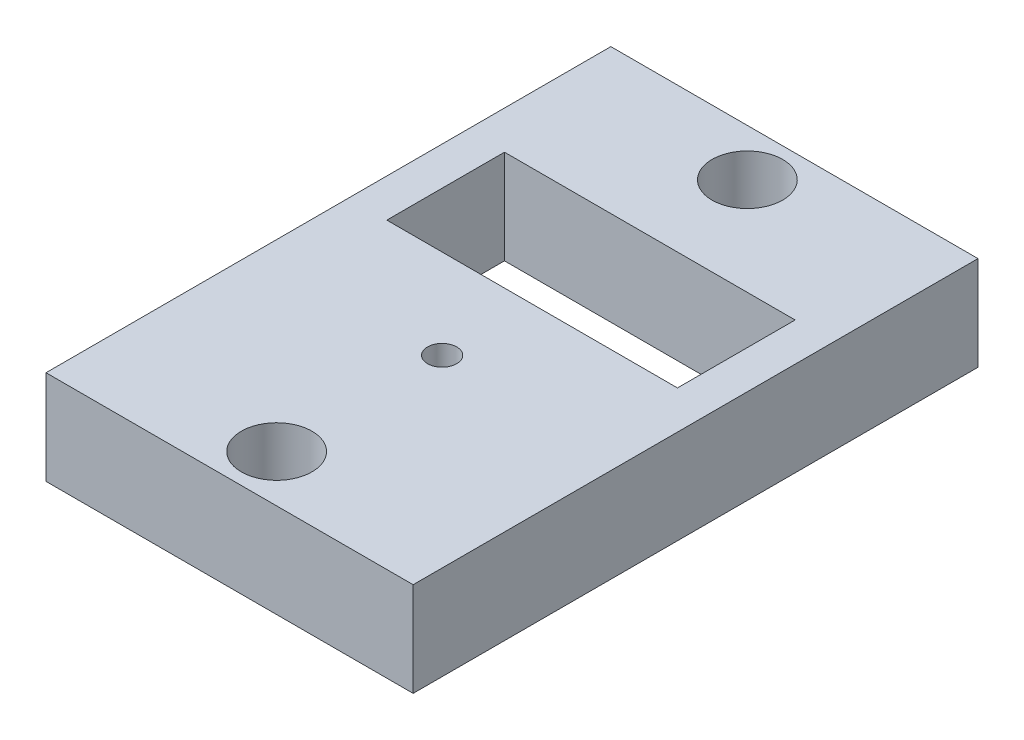
ISO-10303-21;
HEADER;
FILE_DESCRIPTION(('STEP AP214'),'2;1');
FILE_NAME('part.step','',(''),(''),'','','');
FILE_SCHEMA(('AUTOMOTIVE_DESIGN { 1 0 10303 214 1 1 1 1 }'));
ENDSEC;
DATA;
#1=APPLICATION_CONTEXT('core data for automotive mechanical design processes');
#2=APPLICATION_PROTOCOL_DEFINITION('international standard','automotive_design',2000,#1);
#3=PRODUCT_CONTEXT('',#1,'mechanical');
#4=PRODUCT('Part','Part','',(#3));
#5=PRODUCT_RELATED_PRODUCT_CATEGORY('part','',(#4));
#6=PRODUCT_DEFINITION_FORMATION('','',#4);
#7=PRODUCT_DEFINITION_CONTEXT('part definition',#1,'design');
#8=PRODUCT_DEFINITION('design','',#6,#7);
#9=PRODUCT_DEFINITION_SHAPE('','',#8);
#10=(LENGTH_UNIT() NAMED_UNIT(*) SI_UNIT(.MILLI.,.METRE.));
#11=(NAMED_UNIT(*) PLANE_ANGLE_UNIT() SI_UNIT($,.RADIAN.));
#12=(NAMED_UNIT(*) SI_UNIT($,.STERADIAN.) SOLID_ANGLE_UNIT());
#13=UNCERTAINTY_MEASURE_WITH_UNIT(LENGTH_MEASURE(1.E-05),#10,'distance_accuracy_value','');
#14=(GEOMETRIC_REPRESENTATION_CONTEXT(3) GLOBAL_UNCERTAINTY_ASSIGNED_CONTEXT((#13)) GLOBAL_UNIT_ASSIGNED_CONTEXT((#10,
#11,#12)) REPRESENTATION_CONTEXT('',''));
#15=CARTESIAN_POINT('',(0.,0.,0.));
#16=DIRECTION('',(0.,0.,1.));
#17=DIRECTION('',(1.,0.,0.));
#18=AXIS2_PLACEMENT_3D('',#15,#16,#17);
#19=CARTESIAN_POINT('',(-78.,10.,60.));
#20=DIRECTION('',(1.,0.,0.));
#21=DIRECTION('',(0.,0.,-1.));
#22=AXIS2_PLACEMENT_3D('',#19,#20,#21);
#23=PLANE('',#22);
#24=DIRECTION('',(0.,0.,1.));
#25=VECTOR('',#24,1.);
#26=CARTESIAN_POINT('',(-78.,-10.,60.));
#27=LINE('',#26,#25);
#28=CARTESIAN_POINT('',(-78.,-10.,-60.));
#29=VERTEX_POINT('',#28);
#30=CARTESIAN_POINT('',(-78.,-10.,60.));
#31=VERTEX_POINT('',#30);
#32=EDGE_CURVE('E109',#29,#31,#27,.T.);
#33=ORIENTED_EDGE('',*,*,#32,.T.);
#34=DIRECTION('',(0.,-1.,0.));
#35=VECTOR('',#34,1.);
#36=CARTESIAN_POINT('',(-78.,10.,60.));
#37=LINE('',#36,#35);
#38=CARTESIAN_POINT('',(-78.,10.,60.));
#39=VERTEX_POINT('',#38);
#40=EDGE_CURVE('E11',#39,#31,#37,.T.);
#41=ORIENTED_EDGE('',*,*,#40,.F.);
#42=DIRECTION('',(0.,0.,1.));
#43=VECTOR('',#42,1.);
#44=CARTESIAN_POINT('',(-78.,10.,60.));
#45=LINE('',#44,#43);
#46=CARTESIAN_POINT('',(-78.,10.,-60.));
#47=VERTEX_POINT('',#46);
#48=EDGE_CURVE('E138',#47,#39,#45,.T.);
#49=ORIENTED_EDGE('',*,*,#48,.F.);
#50=DIRECTION('',(0.,-1.,0.));
#51=VECTOR('',#50,1.);
#52=CARTESIAN_POINT('',(-78.,10.,-60.));
#53=LINE('',#52,#51);
#54=EDGE_CURVE('E148',#47,#29,#53,.T.);
#55=ORIENTED_EDGE('',*,*,#54,.T.);
#56=EDGE_LOOP('',(#33,#41,#49,#55));
#57=FACE_BOUND('',#56,.T.);
#58=ADVANCED_FACE('F39',(#57),#23,.F.);
#59=CARTESIAN_POINT('',(-78.,10.,60.));
#60=DIRECTION('',(0.,0.,-1.));
#61=DIRECTION('',(-1.,0.,0.));
#62=AXIS2_PLACEMENT_3D('',#59,#60,#61);
#63=PLANE('',#62);
#64=DIRECTION('',(1.,0.,0.));
#65=VECTOR('',#64,1.);
#66=CARTESIAN_POINT('',(-78.,-10.,60.));
#67=LINE('',#66,#65);
#68=CARTESIAN_POINT('',(0.,-10.,60.));
#69=VERTEX_POINT('',#68);
#70=EDGE_CURVE('E151',#31,#69,#67,.T.);
#71=ORIENTED_EDGE('',*,*,#70,.T.);
#72=DIRECTION('',(0.,-1.,0.));
#73=VECTOR('',#72,1.);
#74=CARTESIAN_POINT('',(0.,10.,60.));
#75=LINE('',#74,#73);
#76=CARTESIAN_POINT('',(0.,10.,60.));
#77=VERTEX_POINT('',#76);
#78=EDGE_CURVE('E46',#77,#69,#75,.T.);
#79=ORIENTED_EDGE('',*,*,#78,.F.);
#80=DIRECTION('',(1.,0.,0.));
#81=VECTOR('',#80,1.);
#82=CARTESIAN_POINT('',(-78.,10.,60.));
#83=LINE('',#82,#81);
#84=EDGE_CURVE('E141',#39,#77,#83,.T.);
#85=ORIENTED_EDGE('',*,*,#84,.F.);
#86=ORIENTED_EDGE('',*,*,#40,.T.);
#87=EDGE_LOOP('',(#71,#79,#85,#86));
#88=FACE_BOUND('',#87,.T.);
#89=ADVANCED_FACE('F179',(#88),#63,.F.);
#90=CARTESIAN_POINT('',(0.,10.,60.));
#91=DIRECTION('',(-1.,0.,0.));
#92=DIRECTION('',(0.,0.,1.));
#93=AXIS2_PLACEMENT_3D('',#90,#91,#92);
#94=PLANE('',#93);
#95=DIRECTION('',(0.,0.,-1.));
#96=VECTOR('',#95,1.);
#97=CARTESIAN_POINT('',(0.,-10.,60.));
#98=LINE('',#97,#96);
#99=CARTESIAN_POINT('',(0.,-10.,-60.));
#100=VERTEX_POINT('',#99);
#101=EDGE_CURVE('E153',#69,#100,#98,.T.);
#102=ORIENTED_EDGE('',*,*,#101,.T.);
#103=DIRECTION('',(0.,-1.,0.));
#104=VECTOR('',#103,1.);
#105=CARTESIAN_POINT('',(0.,10.,-60.));
#106=LINE('',#105,#104);
#107=CARTESIAN_POINT('',(0.,10.,-60.));
#108=VERTEX_POINT('',#107);
#109=EDGE_CURVE('E158',#108,#100,#106,.T.);
#110=ORIENTED_EDGE('',*,*,#109,.F.);
#111=DIRECTION('',(0.,0.,-1.));
#112=VECTOR('',#111,1.);
#113=CARTESIAN_POINT('',(0.,10.,60.));
#114=LINE('',#113,#112);
#115=EDGE_CURVE('E144',#77,#108,#114,.T.);
#116=ORIENTED_EDGE('',*,*,#115,.F.);
#117=ORIENTED_EDGE('',*,*,#78,.T.);
#118=EDGE_LOOP('',(#102,#110,#116,#117));
#119=FACE_BOUND('',#118,.T.);
#120=ADVANCED_FACE('F165',(#119),#94,.F.);
#121=CARTESIAN_POINT('',(-78.,10.,-60.));
#122=DIRECTION('',(0.,0.,1.));
#123=DIRECTION('',(1.,0.,0.));
#124=AXIS2_PLACEMENT_3D('',#121,#122,#123);
#125=PLANE('',#124);
#126=DIRECTION('',(-1.,0.,0.));
#127=VECTOR('',#126,1.);
#128=CARTESIAN_POINT('',(-78.,-10.,-60.));
#129=LINE('',#128,#127);
#130=EDGE_CURVE('E142',#100,#29,#129,.T.);
#131=ORIENTED_EDGE('',*,*,#130,.T.);
#132=ORIENTED_EDGE('',*,*,#54,.F.);
#133=DIRECTION('',(-1.,0.,0.));
#134=VECTOR('',#133,1.);
#135=CARTESIAN_POINT('',(-78.,10.,-60.));
#136=LINE('',#135,#134);
#137=EDGE_CURVE('E146',#108,#47,#136,.T.);
#138=ORIENTED_EDGE('',*,*,#137,.F.);
#139=ORIENTED_EDGE('',*,*,#109,.T.);
#140=EDGE_LOOP('',(#131,#132,#138,#139));
#141=FACE_BOUND('',#140,.T.);
#142=ADVANCED_FACE('F172',(#141),#125,.F.);
#143=CARTESIAN_POINT('',(0.,10.,0.));
#144=DIRECTION('',(0.,-1.,0.));
#145=DIRECTION('',(0.,0.,-1.));
#146=AXIS2_PLACEMENT_3D('',#143,#144,#145);
#147=PLANE('',#146);
#148=CARTESIAN_POINT('',(-39.125,10.,14.72));
#149=DIRECTION('',(0.,1.,0.));
#150=DIRECTION('',(0.,0.,1.));
#151=AXIS2_PLACEMENT_3D('',#148,#149,#150);
#152=CIRCLE('',#151,3.09999999999999);
#153=CARTESIAN_POINT('',(-39.125,10.,17.82));
#154=VERTEX_POINT('',#153);
#155=EDGE_CURVE('E226',#154,#154,#152,.T.);
#156=ORIENTED_EDGE('',*,*,#155,.F.);
#157=EDGE_LOOP('',(#156));
#158=FACE_BOUND('',#157,.T.);
#159=CARTESIAN_POINT('',(-39.,10.,-50.));
#160=DIRECTION('',(0.,1.,0.));
#161=DIRECTION('',(0.,0.,1.));
#162=AXIS2_PLACEMENT_3D('',#159,#160,#161);
#163=CIRCLE('',#162,7.5);
#164=CARTESIAN_POINT('',(-39.,10.,-42.5));
#165=VERTEX_POINT('',#164);
#166=EDGE_CURVE('E234',#165,#165,#163,.T.);
#167=ORIENTED_EDGE('',*,*,#166,.F.);
#168=EDGE_LOOP('',(#167));
#169=FACE_BOUND('',#168,.T.);
#170=CARTESIAN_POINT('',(-39.,10.,50.));
#171=DIRECTION('',(0.,1.,0.));
#172=DIRECTION('',(0.,0.,1.));
#173=AXIS2_PLACEMENT_3D('',#170,#171,#172);
#174=CIRCLE('',#173,7.5);
#175=CARTESIAN_POINT('',(-39.,10.,57.5));
#176=VERTEX_POINT('',#175);
#177=EDGE_CURVE('E227',#176,#176,#174,.T.);
#178=ORIENTED_EDGE('',*,*,#177,.F.);
#179=EDGE_LOOP('',(#178));
#180=FACE_BOUND('',#179,.T.);
#181=DIRECTION('',(1.,0.,0.));
#182=VECTOR('',#181,1.);
#183=CARTESIAN_POINT('',(-69.875,10.,-4.27999999999999));
#184=LINE('',#183,#182);
#185=CARTESIAN_POINT('',(-69.875,10.,-4.27999999999999));
#186=VERTEX_POINT('',#185);
#187=CARTESIAN_POINT('',(-8.12500000000001,10.,-4.27999999999999));
#188=VERTEX_POINT('',#187);
#189=EDGE_CURVE('E122',#186,#188,#184,.T.);
#190=ORIENTED_EDGE('',*,*,#189,.F.);
#191=DIRECTION('',(0.,0.,1.));
#192=VECTOR('',#191,1.);
#193=CARTESIAN_POINT('',(-69.875,10.,-29.28));
#194=LINE('',#193,#192);
#195=CARTESIAN_POINT('',(-69.875,10.,-29.28));
#196=VERTEX_POINT('',#195);
#197=EDGE_CURVE('E53',#196,#186,#194,.T.);
#198=ORIENTED_EDGE('',*,*,#197,.F.);
#199=DIRECTION('',(-1.,0.,0.));
#200=VECTOR('',#199,1.);
#201=CARTESIAN_POINT('',(-69.875,10.,-29.28));
#202=LINE('',#201,#200);
#203=CARTESIAN_POINT('',(-8.12500000000001,10.,-29.28));
#204=VERTEX_POINT('',#203);
#205=EDGE_CURVE('E115',#204,#196,#202,.T.);
#206=ORIENTED_EDGE('',*,*,#205,.F.);
#207=DIRECTION('',(0.,0.,-1.));
#208=VECTOR('',#207,1.);
#209=CARTESIAN_POINT('',(-8.12500000000001,10.,-29.28));
#210=LINE('',#209,#208);
#211=EDGE_CURVE('E129',#188,#204,#210,.T.);
#212=ORIENTED_EDGE('',*,*,#211,.F.);
#213=EDGE_LOOP('',(#190,#198,#206,#212));
#214=FACE_BOUND('',#213,.T.);
#215=ORIENTED_EDGE('',*,*,#48,.T.);
#216=ORIENTED_EDGE('',*,*,#84,.T.);
#217=ORIENTED_EDGE('',*,*,#115,.T.);
#218=ORIENTED_EDGE('',*,*,#137,.T.);
#219=EDGE_LOOP('',(#215,#216,#217,#218));
#220=FACE_BOUND('',#219,.T.);
#221=ADVANCED_FACE('F178',(#158,#169,#180,#214,#220),#147,.F.);
#222=CARTESIAN_POINT('',(0.,-10.,0.));
#223=DIRECTION('',(0.,-1.,0.));
#224=DIRECTION('',(0.,0.,-1.));
#225=AXIS2_PLACEMENT_3D('',#222,#223,#224);
#226=PLANE('',#225);
#227=CARTESIAN_POINT('',(-39.125,-10.,14.72));
#228=DIRECTION('',(0.,-1.,0.));
#229=DIRECTION('',(0.,0.,-1.));
#230=AXIS2_PLACEMENT_3D('',#227,#228,#229);
#231=CIRCLE('',#230,3.09999999999999);
#232=CARTESIAN_POINT('',(-39.125,-10.,11.62));
#233=VERTEX_POINT('',#232);
#234=EDGE_CURVE('E223',#233,#233,#231,.F.);
#235=ORIENTED_EDGE('',*,*,#234,.T.);
#236=EDGE_LOOP('',(#235));
#237=FACE_BOUND('',#236,.T.);
#238=CARTESIAN_POINT('',(-39.,-10.,-50.));
#239=DIRECTION('',(0.,-1.,0.));
#240=DIRECTION('',(0.,0.,-1.));
#241=AXIS2_PLACEMENT_3D('',#238,#239,#240);
#242=CIRCLE('',#241,7.5);
#243=CARTESIAN_POINT('',(-39.,-10.,-57.5));
#244=VERTEX_POINT('',#243);
#245=EDGE_CURVE('E237',#244,#244,#242,.F.);
#246=ORIENTED_EDGE('',*,*,#245,.T.);
#247=EDGE_LOOP('',(#246));
#248=FACE_BOUND('',#247,.T.);
#249=CARTESIAN_POINT('',(-39.,-10.,50.));
#250=DIRECTION('',(0.,-1.,0.));
#251=DIRECTION('',(0.,0.,-1.));
#252=AXIS2_PLACEMENT_3D('',#249,#250,#251);
#253=CIRCLE('',#252,7.5);
#254=CARTESIAN_POINT('',(-39.,-10.,42.5));
#255=VERTEX_POINT('',#254);
#256=EDGE_CURVE('E230',#255,#255,#253,.F.);
#257=ORIENTED_EDGE('',*,*,#256,.T.);
#258=EDGE_LOOP('',(#257));
#259=FACE_BOUND('',#258,.T.);
#260=DIRECTION('',(0.,0.,1.));
#261=VECTOR('',#260,1.);
#262=CARTESIAN_POINT('',(-69.875,-10.,-29.28));
#263=LINE('',#262,#261);
#264=CARTESIAN_POINT('',(-69.875,-10.,-29.28));
#265=VERTEX_POINT('',#264);
#266=CARTESIAN_POINT('',(-69.875,-10.,-4.27999999999999));
#267=VERTEX_POINT('',#266);
#268=EDGE_CURVE('E113',#265,#267,#263,.T.);
#269=ORIENTED_EDGE('',*,*,#268,.T.);
#270=DIRECTION('',(1.,0.,0.));
#271=VECTOR('',#270,1.);
#272=CARTESIAN_POINT('',(-69.875,-10.,-4.27999999999999));
#273=LINE('',#272,#271);
#274=CARTESIAN_POINT('',(-8.12500000000001,-10.,-4.27999999999999));
#275=VERTEX_POINT('',#274);
#276=EDGE_CURVE('E102',#267,#275,#273,.T.);
#277=ORIENTED_EDGE('',*,*,#276,.T.);
#278=DIRECTION('',(0.,0.,-1.));
#279=VECTOR('',#278,1.);
#280=CARTESIAN_POINT('',(-8.12500000000001,-10.,-29.28));
#281=LINE('',#280,#279);
#282=CARTESIAN_POINT('',(-8.12500000000001,-10.,-29.28));
#283=VERTEX_POINT('',#282);
#284=EDGE_CURVE('E124',#275,#283,#281,.T.);
#285=ORIENTED_EDGE('',*,*,#284,.T.);
#286=DIRECTION('',(-1.,0.,0.));
#287=VECTOR('',#286,1.);
#288=CARTESIAN_POINT('',(-69.875,-10.,-29.28));
#289=LINE('',#288,#287);
#290=EDGE_CURVE('E120',#283,#265,#289,.T.);
#291=ORIENTED_EDGE('',*,*,#290,.T.);
#292=EDGE_LOOP('',(#269,#277,#285,#291));
#293=FACE_BOUND('',#292,.T.);
#294=ORIENTED_EDGE('',*,*,#32,.F.);
#295=ORIENTED_EDGE('',*,*,#130,.F.);
#296=ORIENTED_EDGE('',*,*,#101,.F.);
#297=ORIENTED_EDGE('',*,*,#70,.F.);
#298=EDGE_LOOP('',(#294,#295,#296,#297));
#299=FACE_BOUND('',#298,.T.);
#300=ADVANCED_FACE('F118',(#237,#248,#259,#293,#299),#226,.T.);
#301=CARTESIAN_POINT('',(-69.875,-10.001,-29.28));
#302=DIRECTION('',(-1.,0.,0.));
#303=DIRECTION('',(0.,0.,1.));
#304=AXIS2_PLACEMENT_3D('',#301,#302,#303);
#305=PLANE('',#304);
#306=DIRECTION('',(0.,1.,0.));
#307=VECTOR('',#306,1.);
#308=CARTESIAN_POINT('',(-69.875,-10.001,-29.28));
#309=LINE('',#308,#307);
#310=EDGE_CURVE('E110',#265,#196,#309,.T.);
#311=ORIENTED_EDGE('',*,*,#310,.T.);
#312=ORIENTED_EDGE('',*,*,#197,.T.);
#313=DIRECTION('',(0.,1.,0.));
#314=VECTOR('',#313,1.);
#315=CARTESIAN_POINT('',(-69.875,-10.001,-4.27999999999999));
#316=LINE('',#315,#314);
#317=EDGE_CURVE('E104',#267,#186,#316,.T.);
#318=ORIENTED_EDGE('',*,*,#317,.F.);
#319=ORIENTED_EDGE('',*,*,#268,.F.);
#320=EDGE_LOOP('',(#311,#312,#318,#319));
#321=FACE_BOUND('',#320,.T.);
#322=ADVANCED_FACE('F112',(#321),#305,.F.);
#323=CARTESIAN_POINT('',(-69.875,-10.001,-29.28));
#324=DIRECTION('',(0.,0.,-1.));
#325=DIRECTION('',(-1.,0.,0.));
#326=AXIS2_PLACEMENT_3D('',#323,#324,#325);
#327=PLANE('',#326);
#328=DIRECTION('',(0.,1.,0.));
#329=VECTOR('',#328,1.);
#330=CARTESIAN_POINT('',(-8.12500000000001,-10.001,-29.28));
#331=LINE('',#330,#329);
#332=EDGE_CURVE('E135',#283,#204,#331,.T.);
#333=ORIENTED_EDGE('',*,*,#332,.T.);
#334=ORIENTED_EDGE('',*,*,#205,.T.);
#335=ORIENTED_EDGE('',*,*,#310,.F.);
#336=ORIENTED_EDGE('',*,*,#290,.F.);
#337=EDGE_LOOP('',(#333,#334,#335,#336));
#338=FACE_BOUND('',#337,.T.);
#339=ADVANCED_FACE('F197',(#338),#327,.F.);
#340=CARTESIAN_POINT('',(-8.12500000000001,-10.001,-29.28));
#341=DIRECTION('',(1.,0.,0.));
#342=DIRECTION('',(0.,0.,-1.));
#343=AXIS2_PLACEMENT_3D('',#340,#341,#342);
#344=PLANE('',#343);
#345=DIRECTION('',(0.,1.,0.));
#346=VECTOR('',#345,1.);
#347=CARTESIAN_POINT('',(-8.12500000000001,-10.001,-4.27999999999999));
#348=LINE('',#347,#346);
#349=EDGE_CURVE('E61',#275,#188,#348,.T.);
#350=ORIENTED_EDGE('',*,*,#349,.T.);
#351=ORIENTED_EDGE('',*,*,#211,.T.);
#352=ORIENTED_EDGE('',*,*,#332,.F.);
#353=ORIENTED_EDGE('',*,*,#284,.F.);
#354=EDGE_LOOP('',(#350,#351,#352,#353));
#355=FACE_BOUND('',#354,.T.);
#356=ADVANCED_FACE('F201',(#355),#344,.F.);
#357=CARTESIAN_POINT('',(-69.875,-10.001,-4.27999999999999));
#358=DIRECTION('',(0.,0.,1.));
#359=DIRECTION('',(1.,0.,0.));
#360=AXIS2_PLACEMENT_3D('',#357,#358,#359);
#361=PLANE('',#360);
#362=ORIENTED_EDGE('',*,*,#317,.T.);
#363=ORIENTED_EDGE('',*,*,#189,.T.);
#364=ORIENTED_EDGE('',*,*,#349,.F.);
#365=ORIENTED_EDGE('',*,*,#276,.F.);
#366=EDGE_LOOP('',(#362,#363,#364,#365));
#367=FACE_BOUND('',#366,.T.);
#368=ADVANCED_FACE('F103',(#367),#361,.F.);
#369=CARTESIAN_POINT('',(-39.,-10.001,50.));
#370=DIRECTION('',(0.,1.,0.));
#371=DIRECTION('',(0.,0.,1.));
#372=AXIS2_PLACEMENT_3D('',#369,#370,#371);
#373=CYLINDRICAL_SURFACE('',#372,7.5);
#374=ORIENTED_EDGE('',*,*,#256,.F.);
#375=EDGE_LOOP('',(#374));
#376=FACE_BOUND('',#375,.T.);
#377=ORIENTED_EDGE('',*,*,#177,.T.);
#378=EDGE_LOOP('',(#377));
#379=FACE_BOUND('',#378,.T.);
#380=ADVANCED_FACE('F200',(#376,#379),#373,.F.);
#381=CARTESIAN_POINT('',(-39.,-10.001,-50.));
#382=DIRECTION('',(0.,1.,0.));
#383=DIRECTION('',(0.,0.,1.));
#384=AXIS2_PLACEMENT_3D('',#381,#382,#383);
#385=CYLINDRICAL_SURFACE('',#384,7.5);
#386=ORIENTED_EDGE('',*,*,#245,.F.);
#387=EDGE_LOOP('',(#386));
#388=FACE_BOUND('',#387,.T.);
#389=ORIENTED_EDGE('',*,*,#166,.T.);
#390=EDGE_LOOP('',(#389));
#391=FACE_BOUND('',#390,.T.);
#392=ADVANCED_FACE('F210',(#388,#391),#385,.F.);
#393=CARTESIAN_POINT('',(-39.125,-10.001,14.72));
#394=DIRECTION('',(0.,1.,0.));
#395=DIRECTION('',(0.,0.,1.));
#396=AXIS2_PLACEMENT_3D('',#393,#394,#395);
#397=CYLINDRICAL_SURFACE('',#396,3.09999999999999);
#398=ORIENTED_EDGE('',*,*,#234,.F.);
#399=EDGE_LOOP('',(#398));
#400=FACE_BOUND('',#399,.T.);
#401=ORIENTED_EDGE('',*,*,#155,.T.);
#402=EDGE_LOOP('',(#401));
#403=FACE_BOUND('',#402,.T.);
#404=ADVANCED_FACE('F214',(#400,#403),#397,.F.);
#405=CLOSED_SHELL('',(#58,#89,#120,#142,#221,#300,#322,#339,#356,#368,#380,#392,#404));
#406=MANIFOLD_SOLID_BREP('B2',#405);
#407=ADVANCED_BREP_SHAPE_REPRESENTATION('',(#18,#406),#14);
#408=SHAPE_DEFINITION_REPRESENTATION(#9,#407);
ENDSEC;
END-ISO-10303-21;
